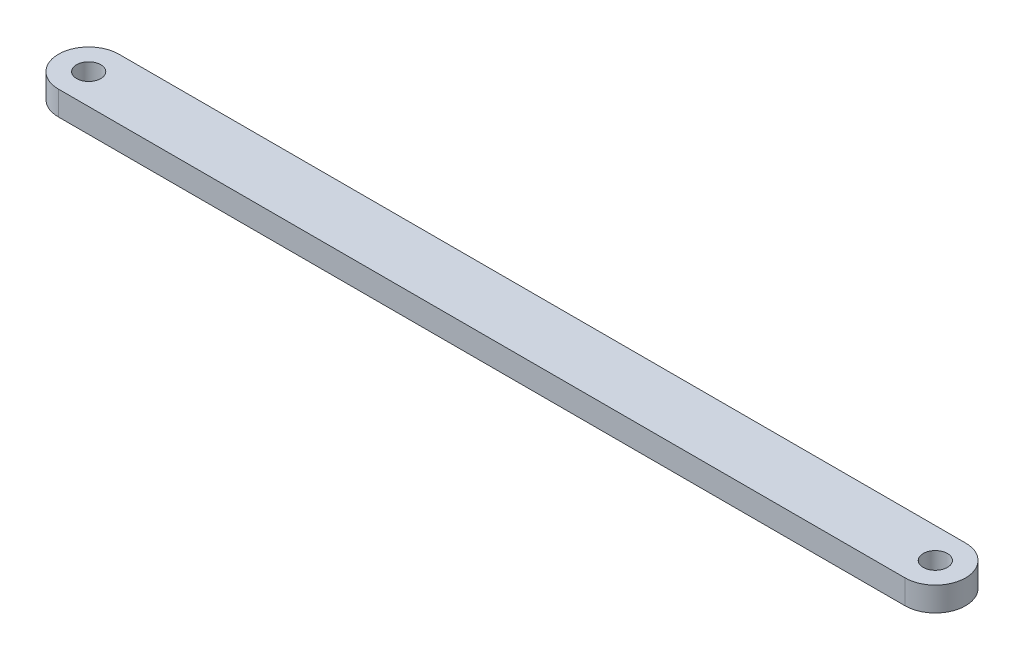
ISO-10303-21;
HEADER;
FILE_DESCRIPTION(('STEP AP214'),'2;1');
FILE_NAME('part.step','',(''),(''),'','','');
FILE_SCHEMA(('AUTOMOTIVE_DESIGN { 1 0 10303 214 1 1 1 1 }'));
ENDSEC;
DATA;
#1=APPLICATION_CONTEXT('core data for automotive mechanical design processes');
#2=APPLICATION_PROTOCOL_DEFINITION('international standard','automotive_design',2000,#1);
#3=PRODUCT_CONTEXT('',#1,'mechanical');
#4=PRODUCT('Part','Part','',(#3));
#5=PRODUCT_RELATED_PRODUCT_CATEGORY('part','',(#4));
#6=PRODUCT_DEFINITION_FORMATION('','',#4);
#7=PRODUCT_DEFINITION_CONTEXT('part definition',#1,'design');
#8=PRODUCT_DEFINITION('design','',#6,#7);
#9=PRODUCT_DEFINITION_SHAPE('','',#8);
#10=(LENGTH_UNIT() NAMED_UNIT(*) SI_UNIT(.MILLI.,.METRE.));
#11=(NAMED_UNIT(*) PLANE_ANGLE_UNIT() SI_UNIT($,.RADIAN.));
#12=(NAMED_UNIT(*) SI_UNIT($,.STERADIAN.) SOLID_ANGLE_UNIT());
#13=UNCERTAINTY_MEASURE_WITH_UNIT(LENGTH_MEASURE(1.E-05),#10,'distance_accuracy_value','');
#14=(GEOMETRIC_REPRESENTATION_CONTEXT(3) GLOBAL_UNCERTAINTY_ASSIGNED_CONTEXT((#13)) GLOBAL_UNIT_ASSIGNED_CONTEXT((#10,
#11,#12)) REPRESENTATION_CONTEXT('',''));
#15=CARTESIAN_POINT('',(0.,0.,0.));
#16=DIRECTION('',(0.,0.,1.));
#17=DIRECTION('',(1.,0.,0.));
#18=AXIS2_PLACEMENT_3D('',#15,#16,#17);
#19=CARTESIAN_POINT('',(0.,2.,0.));
#20=DIRECTION('',(0.,1.,0.));
#21=DIRECTION('',(0.,0.,1.));
#22=AXIS2_PLACEMENT_3D('',#19,#20,#21);
#23=PLANE('',#22);
#24=CARTESIAN_POINT('',(0.,2.,0.));
#25=DIRECTION('',(0.,1.,0.));
#26=DIRECTION('',(0.,0.,1.));
#27=AXIS2_PLACEMENT_3D('',#24,#25,#26);
#28=CIRCLE('',#27,1.);
#29=CARTESIAN_POINT('',(0.,2.,1.));
#30=VERTEX_POINT('',#29);
#31=EDGE_CURVE('E104',#30,#30,#28,.T.);
#32=ORIENTED_EDGE('',*,*,#31,.F.);
#33=EDGE_LOOP('',(#32));
#34=FACE_BOUND('',#33,.T.);
#35=CARTESIAN_POINT('',(0.,2.,0.));
#36=DIRECTION('',(0.,1.,0.));
#37=DIRECTION('',(0.,0.,1.));
#38=AXIS2_PLACEMENT_3D('',#35,#36,#37);
#39=CIRCLE('',#38,2.5);
#40=CARTESIAN_POINT('',(0.,2.,-2.5));
#41=VERTEX_POINT('',#40);
#42=CARTESIAN_POINT('',(0.,2.,2.5));
#43=VERTEX_POINT('',#42);
#44=EDGE_CURVE('E89',#41,#43,#39,.T.);
#45=ORIENTED_EDGE('',*,*,#44,.T.);
#46=DIRECTION('',(1.,0.,0.));
#47=VECTOR('',#46,1.);
#48=CARTESIAN_POINT('',(0.,2.,2.5));
#49=LINE('',#48,#47);
#50=CARTESIAN_POINT('',(70.,2.,2.5));
#51=VERTEX_POINT('',#50);
#52=EDGE_CURVE('E84',#43,#51,#49,.T.);
#53=ORIENTED_EDGE('',*,*,#52,.T.);
#54=CARTESIAN_POINT('',(70.,2.,0.));
#55=DIRECTION('',(0.,1.,0.));
#56=DIRECTION('',(0.,0.,1.));
#57=AXIS2_PLACEMENT_3D('',#54,#55,#56);
#58=CIRCLE('',#57,2.5);
#59=CARTESIAN_POINT('',(70.,2.,-2.5));
#60=VERTEX_POINT('',#59);
#61=EDGE_CURVE('E87',#51,#60,#58,.T.);
#62=ORIENTED_EDGE('',*,*,#61,.T.);
#63=DIRECTION('',(-1.,0.,0.));
#64=VECTOR('',#63,1.);
#65=CARTESIAN_POINT('',(0.,2.,-2.5));
#66=LINE('',#65,#64);
#67=EDGE_CURVE('E54',#60,#41,#66,.T.);
#68=ORIENTED_EDGE('',*,*,#67,.T.);
#69=EDGE_LOOP('',(#45,#53,#62,#68));
#70=FACE_BOUND('',#69,.T.);
#71=CARTESIAN_POINT('',(70.,2.,0.));
#72=DIRECTION('',(0.,1.,0.));
#73=DIRECTION('',(0.,0.,1.));
#74=AXIS2_PLACEMENT_3D('',#71,#72,#73);
#75=CIRCLE('',#74,0.999999999999998);
#76=CARTESIAN_POINT('',(70.,2.,0.999999999999998));
#77=VERTEX_POINT('',#76);
#78=EDGE_CURVE('E119',#77,#77,#75,.T.);
#79=ORIENTED_EDGE('',*,*,#78,.F.);
#80=EDGE_LOOP('',(#79));
#81=FACE_BOUND('',#80,.T.);
#82=ADVANCED_FACE('F37',(#34,#70,#81),#23,.T.);
#83=CARTESIAN_POINT('',(0.,0.,0.));
#84=DIRECTION('',(0.,1.,0.));
#85=DIRECTION('',(0.,0.,1.));
#86=AXIS2_PLACEMENT_3D('',#83,#84,#85);
#87=PLANE('',#86);
#88=CARTESIAN_POINT('',(0.,0.,0.));
#89=DIRECTION('',(0.,1.,0.));
#90=DIRECTION('',(0.,0.,1.));
#91=AXIS2_PLACEMENT_3D('',#88,#89,#90);
#92=CIRCLE('',#91,2.5);
#93=CARTESIAN_POINT('',(0.,0.,-2.5));
#94=VERTEX_POINT('',#93);
#95=CARTESIAN_POINT('',(0.,0.,2.5));
#96=VERTEX_POINT('',#95);
#97=EDGE_CURVE('E101',#94,#96,#92,.T.);
#98=ORIENTED_EDGE('',*,*,#97,.F.);
#99=DIRECTION('',(-1.,0.,0.));
#100=VECTOR('',#99,1.);
#101=CARTESIAN_POINT('',(0.,0.,-2.5));
#102=LINE('',#101,#100);
#103=CARTESIAN_POINT('',(70.,0.,-2.5));
#104=VERTEX_POINT('',#103);
#105=EDGE_CURVE('E77',#104,#94,#102,.T.);
#106=ORIENTED_EDGE('',*,*,#105,.F.);
#107=CARTESIAN_POINT('',(70.,0.,0.));
#108=DIRECTION('',(0.,1.,0.));
#109=DIRECTION('',(0.,0.,1.));
#110=AXIS2_PLACEMENT_3D('',#107,#108,#109);
#111=CIRCLE('',#110,2.5);
#112=CARTESIAN_POINT('',(70.,0.,2.5));
#113=VERTEX_POINT('',#112);
#114=EDGE_CURVE('E71',#113,#104,#111,.T.);
#115=ORIENTED_EDGE('',*,*,#114,.F.);
#116=DIRECTION('',(1.,0.,0.));
#117=VECTOR('',#116,1.);
#118=CARTESIAN_POINT('',(0.,0.,2.5));
#119=LINE('',#118,#117);
#120=EDGE_CURVE('E93',#96,#113,#119,.T.);
#121=ORIENTED_EDGE('',*,*,#120,.F.);
#122=EDGE_LOOP('',(#98,#106,#115,#121));
#123=FACE_BOUND('',#122,.T.);
#124=CARTESIAN_POINT('',(0.,0.,0.));
#125=DIRECTION('',(0.,1.,0.));
#126=DIRECTION('',(0.,0.,1.));
#127=AXIS2_PLACEMENT_3D('',#124,#125,#126);
#128=CIRCLE('',#127,1.);
#129=CARTESIAN_POINT('',(0.,0.,1.));
#130=VERTEX_POINT('',#129);
#131=EDGE_CURVE('E116',#130,#130,#128,.T.);
#132=ORIENTED_EDGE('',*,*,#131,.T.);
#133=EDGE_LOOP('',(#132));
#134=FACE_BOUND('',#133,.T.);
#135=CARTESIAN_POINT('',(70.,0.,0.));
#136=DIRECTION('',(0.,1.,0.));
#137=DIRECTION('',(0.,0.,1.));
#138=AXIS2_PLACEMENT_3D('',#135,#136,#137);
#139=CIRCLE('',#138,0.999999999999998);
#140=CARTESIAN_POINT('',(70.,0.,0.999999999999998));
#141=VERTEX_POINT('',#140);
#142=EDGE_CURVE('E122',#141,#141,#139,.T.);
#143=ORIENTED_EDGE('',*,*,#142,.T.);
#144=EDGE_LOOP('',(#143));
#145=FACE_BOUND('',#144,.T.);
#146=ADVANCED_FACE('F112',(#123,#134,#145),#87,.F.);
#147=CARTESIAN_POINT('',(0.,2.,0.));
#148=DIRECTION('',(0.,-1.,0.));
#149=DIRECTION('',(0.,0.,-1.));
#150=AXIS2_PLACEMENT_3D('',#147,#148,#149);
#151=CYLINDRICAL_SURFACE('',#150,2.5);
#152=ORIENTED_EDGE('',*,*,#97,.T.);
#153=DIRECTION('',(0.,-1.,0.));
#154=VECTOR('',#153,1.);
#155=CARTESIAN_POINT('',(0.,2.,2.5));
#156=LINE('',#155,#154);
#157=EDGE_CURVE('E11',#43,#96,#156,.T.);
#158=ORIENTED_EDGE('',*,*,#157,.F.);
#159=ORIENTED_EDGE('',*,*,#44,.F.);
#160=DIRECTION('',(0.,-1.,0.));
#161=VECTOR('',#160,1.);
#162=CARTESIAN_POINT('',(0.,2.,-2.5));
#163=LINE('',#162,#161);
#164=EDGE_CURVE('E97',#41,#94,#163,.T.);
#165=ORIENTED_EDGE('',*,*,#164,.T.);
#166=EDGE_LOOP('',(#152,#158,#159,#165));
#167=FACE_BOUND('',#166,.T.);
#168=ADVANCED_FACE('F39',(#167),#151,.T.);
#169=CARTESIAN_POINT('',(0.,2.,2.5));
#170=DIRECTION('',(0.,0.,-1.));
#171=DIRECTION('',(-1.,0.,0.));
#172=AXIS2_PLACEMENT_3D('',#169,#170,#171);
#173=PLANE('',#172);
#174=ORIENTED_EDGE('',*,*,#120,.T.);
#175=DIRECTION('',(0.,-1.,0.));
#176=VECTOR('',#175,1.);
#177=CARTESIAN_POINT('',(70.,2.,2.5));
#178=LINE('',#177,#176);
#179=EDGE_CURVE('E46',#51,#113,#178,.T.);
#180=ORIENTED_EDGE('',*,*,#179,.F.);
#181=ORIENTED_EDGE('',*,*,#52,.F.);
#182=ORIENTED_EDGE('',*,*,#157,.T.);
#183=EDGE_LOOP('',(#174,#180,#181,#182));
#184=FACE_BOUND('',#183,.T.);
#185=ADVANCED_FACE('F92',(#184),#173,.F.);
#186=CARTESIAN_POINT('',(70.,2.,0.));
#187=DIRECTION('',(0.,-1.,0.));
#188=DIRECTION('',(0.,0.,-1.));
#189=AXIS2_PLACEMENT_3D('',#186,#187,#188);
#190=CYLINDRICAL_SURFACE('',#189,2.5);
#191=ORIENTED_EDGE('',*,*,#114,.T.);
#192=DIRECTION('',(0.,-1.,0.));
#193=VECTOR('',#192,1.);
#194=CARTESIAN_POINT('',(70.,2.,-2.5));
#195=LINE('',#194,#193);
#196=EDGE_CURVE('E94',#60,#104,#195,.T.);
#197=ORIENTED_EDGE('',*,*,#196,.F.);
#198=ORIENTED_EDGE('',*,*,#61,.F.);
#199=ORIENTED_EDGE('',*,*,#179,.T.);
#200=EDGE_LOOP('',(#191,#197,#198,#199));
#201=FACE_BOUND('',#200,.T.);
#202=ADVANCED_FACE('F95',(#201),#190,.T.);
#203=CARTESIAN_POINT('',(0.,2.,-2.5));
#204=DIRECTION('',(0.,0.,1.));
#205=DIRECTION('',(1.,0.,0.));
#206=AXIS2_PLACEMENT_3D('',#203,#204,#205);
#207=PLANE('',#206);
#208=ORIENTED_EDGE('',*,*,#105,.T.);
#209=ORIENTED_EDGE('',*,*,#164,.F.);
#210=ORIENTED_EDGE('',*,*,#67,.F.);
#211=ORIENTED_EDGE('',*,*,#196,.T.);
#212=EDGE_LOOP('',(#208,#209,#210,#211));
#213=FACE_BOUND('',#212,.T.);
#214=ADVANCED_FACE('F109',(#213),#207,.F.);
#215=CARTESIAN_POINT('',(0.,2.,0.));
#216=DIRECTION('',(0.,-1.,0.));
#217=DIRECTION('',(0.,0.,-1.));
#218=AXIS2_PLACEMENT_3D('',#215,#216,#217);
#219=CYLINDRICAL_SURFACE('',#218,1.);
#220=ORIENTED_EDGE('',*,*,#31,.T.);
#221=EDGE_LOOP('',(#220));
#222=FACE_BOUND('',#221,.T.);
#223=ORIENTED_EDGE('',*,*,#131,.F.);
#224=EDGE_LOOP('',(#223));
#225=FACE_BOUND('',#224,.T.);
#226=ADVANCED_FACE('F139',(#222,#225),#219,.F.);
#227=CARTESIAN_POINT('',(70.,2.,0.));
#228=DIRECTION('',(0.,-1.,0.));
#229=DIRECTION('',(0.,0.,-1.));
#230=AXIS2_PLACEMENT_3D('',#227,#228,#229);
#231=CYLINDRICAL_SURFACE('',#230,0.999999999999998);
#232=ORIENTED_EDGE('',*,*,#78,.T.);
#233=EDGE_LOOP('',(#232));
#234=FACE_BOUND('',#233,.T.);
#235=ORIENTED_EDGE('',*,*,#142,.F.);
#236=EDGE_LOOP('',(#235));
#237=FACE_BOUND('',#236,.T.);
#238=ADVANCED_FACE('F128',(#234,#237),#231,.F.);
#239=CLOSED_SHELL('',(#82,#146,#168,#185,#202,#214,#226,#238));
#240=MANIFOLD_SOLID_BREP('B2',#239);
#241=ADVANCED_BREP_SHAPE_REPRESENTATION('',(#18,#240),#14);
#242=SHAPE_DEFINITION_REPRESENTATION(#9,#241);
ENDSEC;
END-ISO-10303-21;
